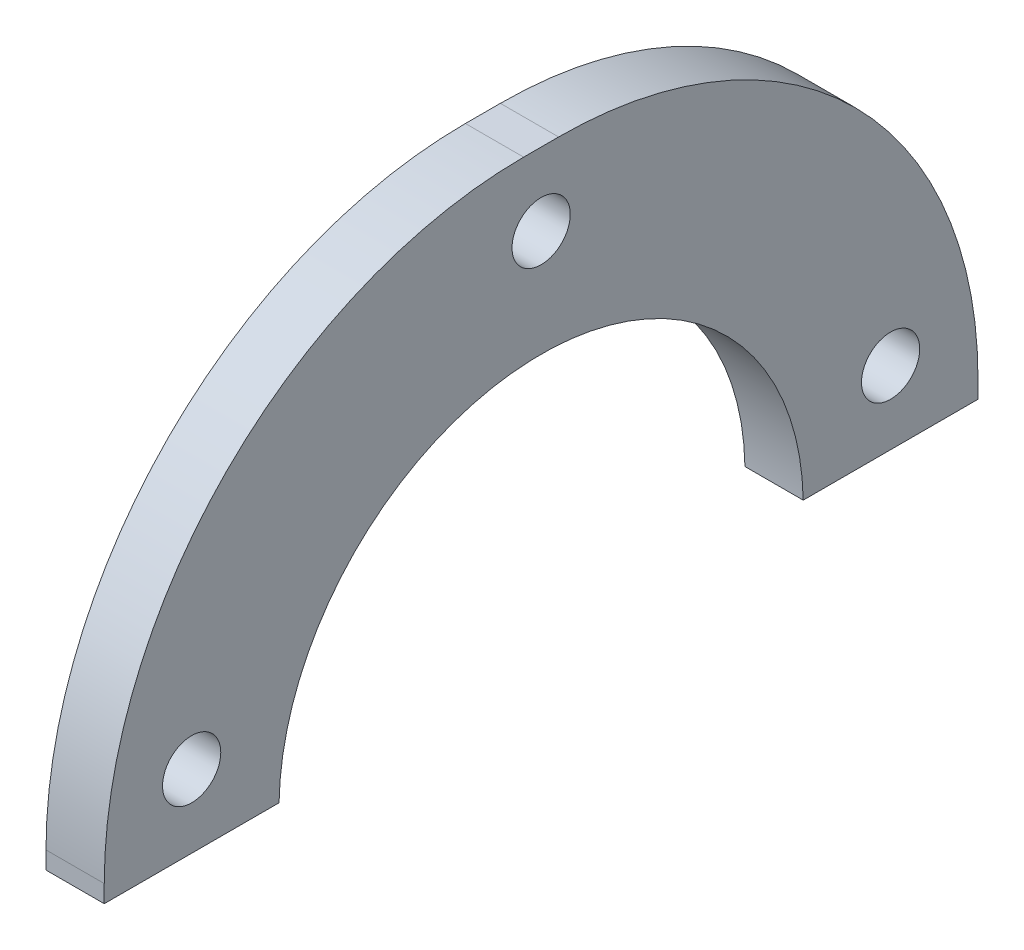
ISO-10303-21;
HEADER;
FILE_DESCRIPTION(('STEP AP214'),'2;1');
FILE_NAME('part.step','',(''),(''),'','','');
FILE_SCHEMA(('AUTOMOTIVE_DESIGN { 1 0 10303 214 1 1 1 1 }'));
ENDSEC;
DATA;
#1=APPLICATION_CONTEXT('core data for automotive mechanical design processes');
#2=APPLICATION_PROTOCOL_DEFINITION('international standard','automotive_design',2000,#1);
#3=PRODUCT_CONTEXT('',#1,'mechanical');
#4=PRODUCT('Part','Part','',(#3));
#5=PRODUCT_RELATED_PRODUCT_CATEGORY('part','',(#4));
#6=PRODUCT_DEFINITION_FORMATION('','',#4);
#7=PRODUCT_DEFINITION_CONTEXT('part definition',#1,'design');
#8=PRODUCT_DEFINITION('design','',#6,#7);
#9=PRODUCT_DEFINITION_SHAPE('','',#8);
#10=(LENGTH_UNIT() NAMED_UNIT(*) SI_UNIT(.MILLI.,.METRE.));
#11=(NAMED_UNIT(*) PLANE_ANGLE_UNIT() SI_UNIT($,.RADIAN.));
#12=(NAMED_UNIT(*) SI_UNIT($,.STERADIAN.) SOLID_ANGLE_UNIT());
#13=UNCERTAINTY_MEASURE_WITH_UNIT(LENGTH_MEASURE(1.E-05),#10,'distance_accuracy_value','');
#14=(GEOMETRIC_REPRESENTATION_CONTEXT(3) GLOBAL_UNCERTAINTY_ASSIGNED_CONTEXT((#13)) GLOBAL_UNIT_ASSIGNED_CONTEXT((#10,
#11,#12)) REPRESENTATION_CONTEXT('',''));
#15=CARTESIAN_POINT('',(0.,0.,0.));
#16=DIRECTION('',(0.,0.,1.));
#17=DIRECTION('',(1.,0.,0.));
#18=AXIS2_PLACEMENT_3D('',#15,#16,#17);
#19=CARTESIAN_POINT('',(3.175,-11.90625,23.8125));
#20=DIRECTION('',(0.,1.,0.));
#21=DIRECTION('',(0.,0.,1.));
#22=AXIS2_PLACEMENT_3D('',#19,#20,#21);
#23=PLANE('',#22);
#24=DIRECTION('',(0.,0.,-1.));
#25=VECTOR('',#24,1.);
#26=CARTESIAN_POINT('',(0.,-11.90625,23.8125));
#27=LINE('',#26,#25);
#28=CARTESIAN_POINT('',(0.,-11.90625,23.8125));
#29=VERTEX_POINT('',#28);
#30=CARTESIAN_POINT('',(0.,-11.90625,14.2852420438017));
#31=VERTEX_POINT('',#30);
#32=EDGE_CURVE('E139',#29,#31,#27,.T.);
#33=ORIENTED_EDGE('',*,*,#32,.T.);
#34=DIRECTION('',(1.,0.,0.));
#35=VECTOR('',#34,1.);
#36=CARTESIAN_POINT('',(0.,-11.90625,14.2852420438017));
#37=LINE('',#36,#35);
#38=CARTESIAN_POINT('',(3.175,-11.90625,14.2852420438017));
#39=VERTEX_POINT('',#38);
#40=EDGE_CURVE('E117',#31,#39,#37,.T.);
#41=ORIENTED_EDGE('',*,*,#40,.T.);
#42=DIRECTION('',(0.,0.,-1.));
#43=VECTOR('',#42,1.);
#44=CARTESIAN_POINT('',(3.175,-11.90625,23.8125));
#45=LINE('',#44,#43);
#46=CARTESIAN_POINT('',(3.175,-11.90625,23.8125));
#47=VERTEX_POINT('',#46);
#48=EDGE_CURVE('E207',#47,#39,#45,.T.);
#49=ORIENTED_EDGE('',*,*,#48,.F.);
#50=DIRECTION('',(-1.,0.,0.));
#51=VECTOR('',#50,1.);
#52=CARTESIAN_POINT('',(3.175,-11.90625,23.8125));
#53=LINE('',#52,#51);
#54=EDGE_CURVE('E157',#47,#29,#53,.T.);
#55=ORIENTED_EDGE('',*,*,#54,.T.);
#56=EDGE_LOOP('',(#33,#41,#49,#55));
#57=FACE_BOUND('',#56,.T.);
#58=ADVANCED_FACE('F43',(#57),#23,.F.);
#59=CARTESIAN_POINT('',(3.175,-11.90625,23.8125));
#60=DIRECTION('',(0.,0.,-1.));
#61=DIRECTION('',(-1.,0.,0.));
#62=AXIS2_PLACEMENT_3D('',#59,#60,#61);
#63=PLANE('',#62);
#64=DIRECTION('',(0.,-1.,0.));
#65=VECTOR('',#64,1.);
#66=CARTESIAN_POINT('',(3.175,-11.90625,23.8125));
#67=LINE('',#66,#65);
#68=CARTESIAN_POINT('',(3.175,-10.95375,23.8125));
#69=VERTEX_POINT('',#68);
#70=EDGE_CURVE('E153',#69,#47,#67,.T.);
#71=ORIENTED_EDGE('',*,*,#70,.F.);
#72=DIRECTION('',(-1.,0.,0.));
#73=VECTOR('',#72,1.);
#74=CARTESIAN_POINT('',(3.175,-10.95375,23.8125));
#75=LINE('',#74,#73);
#76=CARTESIAN_POINT('',(0.,-10.95375,23.8125));
#77=VERTEX_POINT('',#76);
#78=EDGE_CURVE('E11',#69,#77,#75,.T.);
#79=ORIENTED_EDGE('',*,*,#78,.T.);
#80=DIRECTION('',(0.,-1.,0.));
#81=VECTOR('',#80,1.);
#82=CARTESIAN_POINT('',(0.,-11.90625,23.8125));
#83=LINE('',#82,#81);
#84=EDGE_CURVE('E140',#77,#29,#83,.T.);
#85=ORIENTED_EDGE('',*,*,#84,.T.);
#86=ORIENTED_EDGE('',*,*,#54,.F.);
#87=EDGE_LOOP('',(#71,#79,#85,#86));
#88=FACE_BOUND('',#87,.T.);
#89=ADVANCED_FACE('F256',(#88),#63,.F.);
#90=CARTESIAN_POINT('',(3.175,-11.90625,-14.2852420438017));
#91=VERTEX_POINT('',#90);
#92=CARTESIAN_POINT('',(3.175,-11.90625,-23.8125));
#93=VERTEX_POINT('',#92);
#94=EDGE_CURVE('E131',#91,#93,#45,.T.);
#95=ORIENTED_EDGE('',*,*,#94,.F.);
#96=DIRECTION('',(1.,0.,0.));
#97=VECTOR('',#96,1.);
#98=CARTESIAN_POINT('',(0.,-11.90625,-14.2852420438017));
#99=LINE('',#98,#97);
#100=CARTESIAN_POINT('',(0.,-11.90625,-14.2852420438017));
#101=VERTEX_POINT('',#100);
#102=EDGE_CURVE('E114',#91,#101,#99,.F.);
#103=ORIENTED_EDGE('',*,*,#102,.T.);
#104=CARTESIAN_POINT('',(0.,-11.90625,-23.8125));
#105=VERTEX_POINT('',#104);
#106=EDGE_CURVE('E129',#101,#105,#27,.T.);
#107=ORIENTED_EDGE('',*,*,#106,.T.);
#108=DIRECTION('',(-1.,0.,0.));
#109=VECTOR('',#108,1.);
#110=CARTESIAN_POINT('',(3.175,-11.90625,-23.8125));
#111=LINE('',#110,#109);
#112=EDGE_CURVE('E154',#93,#105,#111,.T.);
#113=ORIENTED_EDGE('',*,*,#112,.F.);
#114=EDGE_LOOP('',(#95,#103,#107,#113));
#115=FACE_BOUND('',#114,.T.);
#116=ADVANCED_FACE('F127',(#115),#23,.F.);
#117=CARTESIAN_POINT('',(3.175,-11.90625,-23.8125));
#118=DIRECTION('',(0.,0.,1.));
#119=DIRECTION('',(0.,-1.,0.));
#120=AXIS2_PLACEMENT_3D('',#117,#118,#119);
#121=PLANE('',#120);
#122=DIRECTION('',(0.,1.,0.));
#123=VECTOR('',#122,1.);
#124=CARTESIAN_POINT('',(0.,-11.90625,-23.8125));
#125=LINE('',#124,#123);
#126=CARTESIAN_POINT('',(0.,-10.95375,-23.8125));
#127=VERTEX_POINT('',#126);
#128=EDGE_CURVE('E137',#105,#127,#125,.T.);
#129=ORIENTED_EDGE('',*,*,#128,.T.);
#130=DIRECTION('',(-1.,0.,0.));
#131=VECTOR('',#130,1.);
#132=CARTESIAN_POINT('',(3.175,-10.95375,-23.8125));
#133=LINE('',#132,#131);
#134=CARTESIAN_POINT('',(3.175,-10.95375,-23.8125));
#135=VERTEX_POINT('',#134);
#136=EDGE_CURVE('E67',#127,#135,#133,.F.);
#137=ORIENTED_EDGE('',*,*,#136,.T.);
#138=DIRECTION('',(0.,1.,0.));
#139=VECTOR('',#138,1.);
#140=CARTESIAN_POINT('',(3.175,-11.90625,-23.8125));
#141=LINE('',#140,#139);
#142=EDGE_CURVE('E197',#93,#135,#141,.T.);
#143=ORIENTED_EDGE('',*,*,#142,.F.);
#144=ORIENTED_EDGE('',*,*,#112,.T.);
#145=EDGE_LOOP('',(#129,#137,#143,#144));
#146=FACE_BOUND('',#145,.T.);
#147=ADVANCED_FACE('F205',(#146),#121,.F.);
#148=CARTESIAN_POINT('',(3.175,11.90625,-23.8125));
#149=DIRECTION('',(0.,-1.,0.));
#150=DIRECTION('',(0.,0.,-1.));
#151=AXIS2_PLACEMENT_3D('',#148,#149,#150);
#152=PLANE('',#151);
#153=DIRECTION('',(0.,0.,1.));
#154=VECTOR('',#153,1.);
#155=CARTESIAN_POINT('',(3.175,11.90625,-23.8125));
#156=LINE('',#155,#154);
#157=CARTESIAN_POINT('',(3.175,11.90625,-0.952499999999998));
#158=VERTEX_POINT('',#157);
#159=CARTESIAN_POINT('',(3.175,11.90625,0.952499999999998));
#160=VERTEX_POINT('',#159);
#161=EDGE_CURVE('E158',#158,#160,#156,.T.);
#162=ORIENTED_EDGE('',*,*,#161,.F.);
#163=DIRECTION('',(-1.,0.,0.));
#164=VECTOR('',#163,1.);
#165=CARTESIAN_POINT('',(3.175,11.90625,-0.952499999999998));
#166=LINE('',#165,#164);
#167=CARTESIAN_POINT('',(0.,11.90625,-0.952499999999998));
#168=VERTEX_POINT('',#167);
#169=EDGE_CURVE('E180',#158,#168,#166,.T.);
#170=ORIENTED_EDGE('',*,*,#169,.T.);
#171=DIRECTION('',(0.,0.,1.));
#172=VECTOR('',#171,1.);
#173=CARTESIAN_POINT('',(0.,11.90625,-23.8125));
#174=LINE('',#173,#172);
#175=CARTESIAN_POINT('',(0.,11.90625,0.952499999999998));
#176=VERTEX_POINT('',#175);
#177=EDGE_CURVE('E149',#168,#176,#174,.T.);
#178=ORIENTED_EDGE('',*,*,#177,.T.);
#179=DIRECTION('',(-1.,0.,0.));
#180=VECTOR('',#179,1.);
#181=CARTESIAN_POINT('',(3.175,11.90625,0.952499999999998));
#182=LINE('',#181,#180);
#183=EDGE_CURVE('E162',#176,#160,#182,.F.);
#184=ORIENTED_EDGE('',*,*,#183,.T.);
#185=EDGE_LOOP('',(#162,#170,#178,#184));
#186=FACE_BOUND('',#185,.T.);
#187=ADVANCED_FACE('F201',(#186),#152,.F.);
#188=CARTESIAN_POINT('',(3.175,0.,0.));
#189=DIRECTION('',(1.,0.,0.));
#190=DIRECTION('',(0.,0.,-1.));
#191=AXIS2_PLACEMENT_3D('',#188,#189,#190);
#192=PLANE('',#191);
#193=CARTESIAN_POINT('',(3.175,-7.9375,19.0488710219009));
#194=DIRECTION('',(1.,0.,0.));
#195=DIRECTION('',(0.,0.,-1.));
#196=AXIS2_PLACEMENT_3D('',#193,#194,#195);
#197=CIRCLE('',#196,1.5875);
#198=CARTESIAN_POINT('',(3.175,-7.9375,17.4613710219009));
#199=VERTEX_POINT('',#198);
#200=EDGE_CURVE('E177',#199,#199,#197,.T.);
#201=ORIENTED_EDGE('',*,*,#200,.F.);
#202=EDGE_LOOP('',(#201));
#203=FACE_BOUND('',#202,.T.);
#204=CARTESIAN_POINT('',(3.175,7.9375,0.));
#205=DIRECTION('',(1.,0.,0.));
#206=DIRECTION('',(0.,0.,-1.));
#207=AXIS2_PLACEMENT_3D('',#204,#205,#206);
#208=CIRCLE('',#207,1.5875);
#209=CARTESIAN_POINT('',(3.175,7.9375,-1.5875));
#210=VERTEX_POINT('',#209);
#211=EDGE_CURVE('E172',#210,#210,#208,.T.);
#212=ORIENTED_EDGE('',*,*,#211,.F.);
#213=EDGE_LOOP('',(#212));
#214=FACE_BOUND('',#213,.T.);
#215=CARTESIAN_POINT('',(3.175,-7.9375,-19.0488710219009));
#216=DIRECTION('',(1.,0.,0.));
#217=DIRECTION('',(0.,0.,-1.));
#218=AXIS2_PLACEMENT_3D('',#215,#216,#217);
#219=CIRCLE('',#218,1.5875);
#220=CARTESIAN_POINT('',(3.175,-7.9375,-20.6363710219009));
#221=VERTEX_POINT('',#220);
#222=EDGE_CURVE('E167',#221,#221,#219,.T.);
#223=ORIENTED_EDGE('',*,*,#222,.F.);
#224=EDGE_LOOP('',(#223));
#225=FACE_BOUND('',#224,.T.);
#226=ORIENTED_EDGE('',*,*,#142,.T.);
#227=CARTESIAN_POINT('',(3.175,-10.95375,-0.952500000000002));
#228=DIRECTION('',(1.,0.,0.));
#229=DIRECTION('',(0.,0.,-1.));
#230=AXIS2_PLACEMENT_3D('',#227,#228,#229);
#231=CIRCLE('',#230,22.86);
#232=EDGE_CURVE('E52',#135,#158,#231,.T.);
#233=ORIENTED_EDGE('',*,*,#232,.T.);
#234=ORIENTED_EDGE('',*,*,#161,.T.);
#235=CARTESIAN_POINT('',(3.175,-10.95375,0.952499999999995));
#236=DIRECTION('',(1.,0.,0.));
#237=DIRECTION('',(0.,0.,-1.));
#238=AXIS2_PLACEMENT_3D('',#235,#236,#237);
#239=CIRCLE('',#238,22.86);
#240=EDGE_CURVE('E59',#160,#69,#239,.T.);
#241=ORIENTED_EDGE('',*,*,#240,.T.);
#242=ORIENTED_EDGE('',*,*,#70,.T.);
#243=ORIENTED_EDGE('',*,*,#48,.T.);
#244=CARTESIAN_POINT('',(3.175,-12.16025,0.));
#245=DIRECTION('',(1.,0.,0.));
#246=DIRECTION('',(0.,0.,-1.));
#247=AXIS2_PLACEMENT_3D('',#244,#245,#246);
#248=CIRCLE('',#247,14.2875);
#249=EDGE_CURVE('E123',#91,#39,#248,.T.);
#250=ORIENTED_EDGE('',*,*,#249,.F.);
#251=ORIENTED_EDGE('',*,*,#94,.T.);
#252=EDGE_LOOP('',(#226,#233,#234,#241,#242,#243,#250,#251));
#253=FACE_BOUND('',#252,.T.);
#254=ADVANCED_FACE('F196',(#203,#214,#225,#253),#192,.T.);
#255=CARTESIAN_POINT('',(0.,0.,0.));
#256=DIRECTION('',(1.,0.,0.));
#257=DIRECTION('',(0.,0.,-1.));
#258=AXIS2_PLACEMENT_3D('',#255,#256,#257);
#259=PLANE('',#258);
#260=CARTESIAN_POINT('',(0.,-7.9375,19.0488710219009));
#261=DIRECTION('',(1.,0.,0.));
#262=DIRECTION('',(0.,0.,-1.));
#263=AXIS2_PLACEMENT_3D('',#260,#261,#262);
#264=CIRCLE('',#263,1.5875);
#265=CARTESIAN_POINT('',(0.,-7.9375,17.4613710219009));
#266=VERTEX_POINT('',#265);
#267=EDGE_CURVE('E173',#266,#266,#264,.T.);
#268=ORIENTED_EDGE('',*,*,#267,.T.);
#269=EDGE_LOOP('',(#268));
#270=FACE_BOUND('',#269,.T.);
#271=CARTESIAN_POINT('',(0.,7.9375,0.));
#272=DIRECTION('',(1.,0.,0.));
#273=DIRECTION('',(0.,0.,-1.));
#274=AXIS2_PLACEMENT_3D('',#271,#272,#273);
#275=CIRCLE('',#274,1.5875);
#276=CARTESIAN_POINT('',(0.,7.9375,-1.5875));
#277=VERTEX_POINT('',#276);
#278=EDGE_CURVE('E168',#277,#277,#275,.T.);
#279=ORIENTED_EDGE('',*,*,#278,.T.);
#280=EDGE_LOOP('',(#279));
#281=FACE_BOUND('',#280,.T.);
#282=CARTESIAN_POINT('',(0.,-7.9375,-19.0488710219009));
#283=DIRECTION('',(1.,0.,0.));
#284=DIRECTION('',(0.,0.,-1.));
#285=AXIS2_PLACEMENT_3D('',#282,#283,#284);
#286=CIRCLE('',#285,1.5875);
#287=CARTESIAN_POINT('',(0.,-7.9375,-20.6363710219009));
#288=VERTEX_POINT('',#287);
#289=EDGE_CURVE('E163',#288,#288,#286,.T.);
#290=ORIENTED_EDGE('',*,*,#289,.T.);
#291=EDGE_LOOP('',(#290));
#292=FACE_BOUND('',#291,.T.);
#293=ORIENTED_EDGE('',*,*,#177,.F.);
#294=CARTESIAN_POINT('',(0.,-10.95375,-0.952500000000002));
#295=DIRECTION('',(1.,0.,0.));
#296=DIRECTION('',(0.,0.,-1.));
#297=AXIS2_PLACEMENT_3D('',#294,#295,#296);
#298=CIRCLE('',#297,22.86);
#299=EDGE_CURVE('E187',#168,#127,#298,.F.);
#300=ORIENTED_EDGE('',*,*,#299,.T.);
#301=ORIENTED_EDGE('',*,*,#128,.F.);
#302=ORIENTED_EDGE('',*,*,#106,.F.);
#303=CARTESIAN_POINT('',(0.,-12.16025,0.));
#304=DIRECTION('',(1.,0.,0.));
#305=DIRECTION('',(0.,0.,-1.));
#306=AXIS2_PLACEMENT_3D('',#303,#304,#305);
#307=CIRCLE('',#306,14.2875);
#308=EDGE_CURVE('E111',#101,#31,#307,.T.);
#309=ORIENTED_EDGE('',*,*,#308,.T.);
#310=ORIENTED_EDGE('',*,*,#32,.F.);
#311=ORIENTED_EDGE('',*,*,#84,.F.);
#312=CARTESIAN_POINT('',(0.,-10.95375,0.952499999999995));
#313=DIRECTION('',(1.,0.,0.));
#314=DIRECTION('',(0.,0.,-1.));
#315=AXIS2_PLACEMENT_3D('',#312,#313,#314);
#316=CIRCLE('',#315,22.86);
#317=EDGE_CURVE('E184',#77,#176,#316,.F.);
#318=ORIENTED_EDGE('',*,*,#317,.T.);
#319=EDGE_LOOP('',(#293,#300,#301,#302,#309,#310,#311,#318));
#320=FACE_BOUND('',#319,.T.);
#321=ADVANCED_FACE('F136',(#270,#281,#292,#320),#259,.F.);
#322=CARTESIAN_POINT('',(0.,-12.16025,0.));
#323=DIRECTION('',(1.,0.,0.));
#324=DIRECTION('',(0.,0.,-1.));
#325=AXIS2_PLACEMENT_3D('',#322,#323,#324);
#326=CYLINDRICAL_SURFACE('',#325,14.2875);
#327=ORIENTED_EDGE('',*,*,#308,.F.);
#328=ORIENTED_EDGE('',*,*,#102,.F.);
#329=ORIENTED_EDGE('',*,*,#249,.T.);
#330=ORIENTED_EDGE('',*,*,#40,.F.);
#331=EDGE_LOOP('',(#327,#328,#329,#330));
#332=FACE_BOUND('',#331,.T.);
#333=ADVANCED_FACE('F113',(#332),#326,.F.);
#334=CARTESIAN_POINT('',(3.175,-7.9375,-19.0488710219009));
#335=DIRECTION('',(1.,0.,0.));
#336=DIRECTION('',(0.,0.,-1.));
#337=AXIS2_PLACEMENT_3D('',#334,#335,#336);
#338=CYLINDRICAL_SURFACE('',#337,1.5875);
#339=ORIENTED_EDGE('',*,*,#222,.T.);
#340=EDGE_LOOP('',(#339));
#341=FACE_BOUND('',#340,.T.);
#342=ORIENTED_EDGE('',*,*,#289,.F.);
#343=EDGE_LOOP('',(#342));
#344=FACE_BOUND('',#343,.T.);
#345=ADVANCED_FACE('F239',(#341,#344),#338,.F.);
#346=CARTESIAN_POINT('',(3.175,7.9375,0.));
#347=DIRECTION('',(1.,0.,0.));
#348=DIRECTION('',(0.,0.,-1.));
#349=AXIS2_PLACEMENT_3D('',#346,#347,#348);
#350=CYLINDRICAL_SURFACE('',#349,1.5875);
#351=ORIENTED_EDGE('',*,*,#211,.T.);
#352=EDGE_LOOP('',(#351));
#353=FACE_BOUND('',#352,.T.);
#354=ORIENTED_EDGE('',*,*,#278,.F.);
#355=EDGE_LOOP('',(#354));
#356=FACE_BOUND('',#355,.T.);
#357=ADVANCED_FACE('F242',(#353,#356),#350,.F.);
#358=CARTESIAN_POINT('',(3.175,-7.9375,19.0488710219009));
#359=DIRECTION('',(1.,0.,0.));
#360=DIRECTION('',(0.,0.,-1.));
#361=AXIS2_PLACEMENT_3D('',#358,#359,#360);
#362=CYLINDRICAL_SURFACE('',#361,1.5875);
#363=ORIENTED_EDGE('',*,*,#200,.T.);
#364=EDGE_LOOP('',(#363));
#365=FACE_BOUND('',#364,.T.);
#366=ORIENTED_EDGE('',*,*,#267,.F.);
#367=EDGE_LOOP('',(#366));
#368=FACE_BOUND('',#367,.T.);
#369=ADVANCED_FACE('F229',(#365,#368),#362,.F.);
#370=CARTESIAN_POINT('',(3.175,-10.95375,-0.952500000000002));
#371=DIRECTION('',(-1.,0.,0.));
#372=DIRECTION('',(0.,0.,1.));
#373=AXIS2_PLACEMENT_3D('',#370,#371,#372);
#374=CYLINDRICAL_SURFACE('',#373,22.86);
#375=ORIENTED_EDGE('',*,*,#232,.F.);
#376=ORIENTED_EDGE('',*,*,#136,.F.);
#377=ORIENTED_EDGE('',*,*,#299,.F.);
#378=ORIENTED_EDGE('',*,*,#169,.F.);
#379=EDGE_LOOP('',(#375,#376,#377,#378));
#380=FACE_BOUND('',#379,.T.);
#381=ADVANCED_FACE('F204',(#380),#374,.T.);
#382=CARTESIAN_POINT('',(3.175,-10.95375,0.952499999999995));
#383=DIRECTION('',(-1.,0.,0.));
#384=DIRECTION('',(0.,0.,1.));
#385=AXIS2_PLACEMENT_3D('',#382,#383,#384);
#386=CYLINDRICAL_SURFACE('',#385,22.86);
#387=ORIENTED_EDGE('',*,*,#240,.F.);
#388=ORIENTED_EDGE('',*,*,#183,.F.);
#389=ORIENTED_EDGE('',*,*,#317,.F.);
#390=ORIENTED_EDGE('',*,*,#78,.F.);
#391=EDGE_LOOP('',(#387,#388,#389,#390));
#392=FACE_BOUND('',#391,.T.);
#393=ADVANCED_FACE('F45',(#392),#386,.T.);
#394=CLOSED_SHELL('',(#58,#89,#116,#147,#187,#254,#321,#333,#345,#357,#369,#381,#393));
#395=MANIFOLD_SOLID_BREP('B2',#394);
#396=ADVANCED_BREP_SHAPE_REPRESENTATION('',(#18,#395),#14);
#397=SHAPE_DEFINITION_REPRESENTATION(#9,#396);
ENDSEC;
END-ISO-10303-21;
